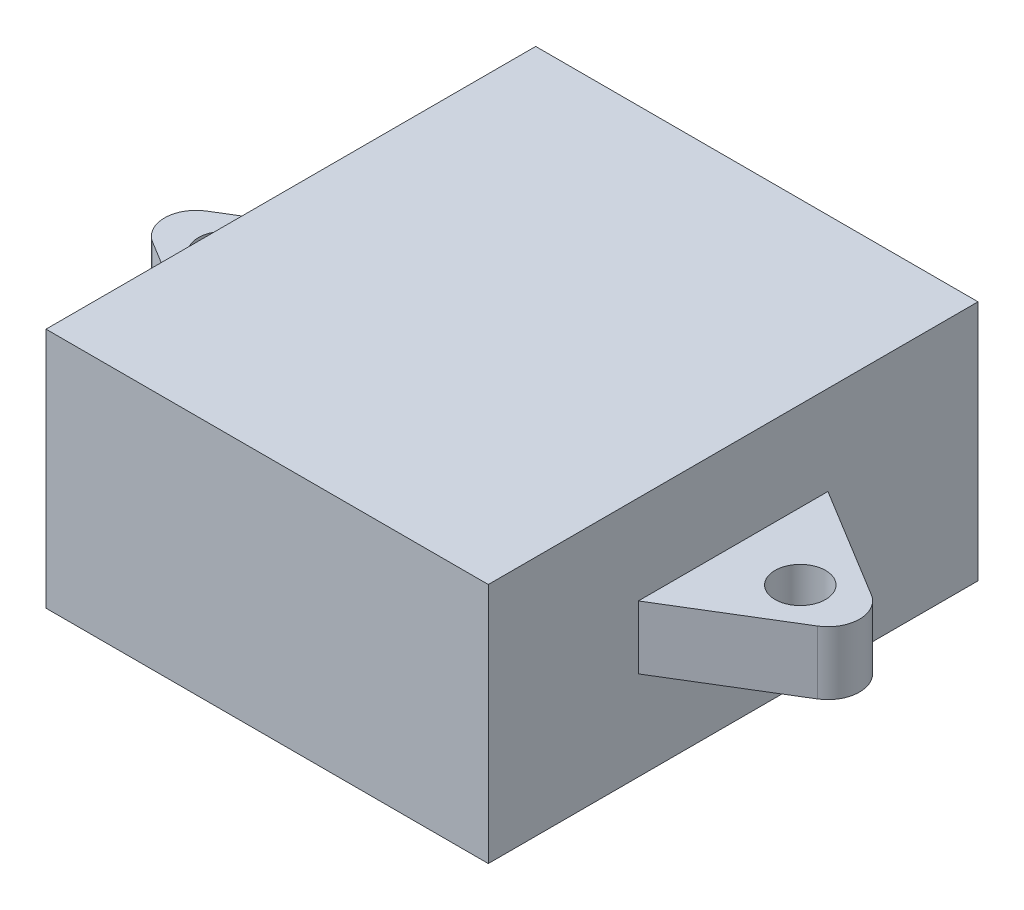
ISO-10303-21;
HEADER;
FILE_DESCRIPTION(('STEP AP214'),'2;1');
FILE_NAME('part.step','',(''),(''),'','','');
FILE_SCHEMA(('AUTOMOTIVE_DESIGN { 1 0 10303 214 1 1 1 1 }'));
ENDSEC;
DATA;
#1=APPLICATION_CONTEXT('core data for automotive mechanical design processes');
#2=APPLICATION_PROTOCOL_DEFINITION('international standard','automotive_design',2000,#1);
#3=PRODUCT_CONTEXT('',#1,'mechanical');
#4=PRODUCT('Part','Part','',(#3));
#5=PRODUCT_RELATED_PRODUCT_CATEGORY('part','',(#4));
#6=PRODUCT_DEFINITION_FORMATION('','',#4);
#7=PRODUCT_DEFINITION_CONTEXT('part definition',#1,'design');
#8=PRODUCT_DEFINITION('design','',#6,#7);
#9=PRODUCT_DEFINITION_SHAPE('','',#8);
#10=(LENGTH_UNIT() NAMED_UNIT(*) SI_UNIT(.MILLI.,.METRE.));
#11=(NAMED_UNIT(*) PLANE_ANGLE_UNIT() SI_UNIT($,.RADIAN.));
#12=(NAMED_UNIT(*) SI_UNIT($,.STERADIAN.) SOLID_ANGLE_UNIT());
#13=UNCERTAINTY_MEASURE_WITH_UNIT(LENGTH_MEASURE(1.E-05),#10,'distance_accuracy_value','');
#14=(GEOMETRIC_REPRESENTATION_CONTEXT(3) GLOBAL_UNCERTAINTY_ASSIGNED_CONTEXT((#13)) GLOBAL_UNIT_ASSIGNED_CONTEXT((#10,
#11,#12)) REPRESENTATION_CONTEXT('',''));
#15=CARTESIAN_POINT('',(0.,0.,0.));
#16=DIRECTION('',(0.,0.,1.));
#17=DIRECTION('',(1.,0.,0.));
#18=AXIS2_PLACEMENT_3D('',#15,#16,#17);
#19=CARTESIAN_POINT('',(14.,15.3,18.7016574585635));
#20=DIRECTION('',(-1.,0.,0.));
#21=DIRECTION('',(0.,0.,1.));
#22=AXIS2_PLACEMENT_3D('',#19,#20,#21);
#23=PLANE('',#22);
#24=DIRECTION('',(0.,0.,1.));
#25=VECTOR('',#24,1.);
#26=CARTESIAN_POINT('',(14.,5.65,-2.79834254143647));
#27=LINE('',#26,#25);
#28=CARTESIAN_POINT('',(14.,5.65,-2.79834254143647));
#29=VERTEX_POINT('',#28);
#30=CARTESIAN_POINT('',(14.,5.65,9.20165745856353));
#31=VERTEX_POINT('',#30);
#32=EDGE_CURVE('E180',#29,#31,#27,.T.);
#33=ORIENTED_EDGE('',*,*,#32,.T.);
#34=DIRECTION('',(0.,1.,0.));
#35=VECTOR('',#34,1.);
#36=CARTESIAN_POINT('',(14.,5.65,9.20165745856353));
#37=LINE('',#36,#35);
#38=CARTESIAN_POINT('',(14.,9.65,9.20165745856353));
#39=VERTEX_POINT('',#38);
#40=EDGE_CURVE('E192',#31,#39,#37,.T.);
#41=ORIENTED_EDGE('',*,*,#40,.T.);
#42=DIRECTION('',(0.,0.,1.));
#43=VECTOR('',#42,1.);
#44=CARTESIAN_POINT('',(14.,9.65,-2.79834254143647));
#45=LINE('',#44,#43);
#46=CARTESIAN_POINT('',(14.,9.65,-2.79834254143647));
#47=VERTEX_POINT('',#46);
#48=EDGE_CURVE('E165',#47,#39,#45,.T.);
#49=ORIENTED_EDGE('',*,*,#48,.F.);
#50=DIRECTION('',(0.,1.,0.));
#51=VECTOR('',#50,1.);
#52=CARTESIAN_POINT('',(14.,5.65,-2.79834254143647));
#53=LINE('',#52,#51);
#54=EDGE_CURVE('E193',#29,#47,#53,.T.);
#55=ORIENTED_EDGE('',*,*,#54,.F.);
#56=EDGE_LOOP('',(#33,#41,#49,#55));
#57=FACE_BOUND('',#56,.T.);
#58=DIRECTION('',(0.,0.,-1.));
#59=VECTOR('',#58,1.);
#60=CARTESIAN_POINT('',(14.,0.,18.7016574585635));
#61=LINE('',#60,#59);
#62=CARTESIAN_POINT('',(14.,0.,18.7016574585635));
#63=VERTEX_POINT('',#62);
#64=CARTESIAN_POINT('',(14.,0.,-12.2983425414365));
#65=VERTEX_POINT('',#64);
#66=EDGE_CURVE('E195',#63,#65,#61,.T.);
#67=ORIENTED_EDGE('',*,*,#66,.T.);
#68=DIRECTION('',(0.,-1.,0.));
#69=VECTOR('',#68,1.);
#70=CARTESIAN_POINT('',(14.,15.3,-12.2983425414365));
#71=LINE('',#70,#69);
#72=CARTESIAN_POINT('',(14.,15.3,-12.2983425414365));
#73=VERTEX_POINT('',#72);
#74=EDGE_CURVE('E11',#73,#65,#71,.T.);
#75=ORIENTED_EDGE('',*,*,#74,.F.);
#76=DIRECTION('',(0.,0.,-1.));
#77=VECTOR('',#76,1.);
#78=CARTESIAN_POINT('',(14.,15.3,18.7016574585635));
#79=LINE('',#78,#77);
#80=CARTESIAN_POINT('',(14.,15.3,18.7016574585635));
#81=VERTEX_POINT('',#80);
#82=EDGE_CURVE('E202',#81,#73,#79,.T.);
#83=ORIENTED_EDGE('',*,*,#82,.F.);
#84=DIRECTION('',(0.,-1.,0.));
#85=VECTOR('',#84,1.);
#86=CARTESIAN_POINT('',(14.,15.3,18.7016574585635));
#87=LINE('',#86,#85);
#88=EDGE_CURVE('E212',#81,#63,#87,.T.);
#89=ORIENTED_EDGE('',*,*,#88,.T.);
#90=EDGE_LOOP('',(#67,#75,#83,#89));
#91=FACE_BOUND('',#90,.T.);
#92=ADVANCED_FACE('F35',(#57,#91),#23,.F.);
#93=CARTESIAN_POINT('',(-14.,15.3,-12.2983425414365));
#94=DIRECTION('',(0.,0.,1.));
#95=DIRECTION('',(1.,0.,0.));
#96=AXIS2_PLACEMENT_3D('',#93,#94,#95);
#97=PLANE('',#96);
#98=DIRECTION('',(-1.,0.,0.));
#99=VECTOR('',#98,1.);
#100=CARTESIAN_POINT('',(-14.,0.,-12.2983425414365));
#101=LINE('',#100,#99);
#102=CARTESIAN_POINT('',(-14.,0.,-12.2983425414365));
#103=VERTEX_POINT('',#102);
#104=EDGE_CURVE('E215',#65,#103,#101,.T.);
#105=ORIENTED_EDGE('',*,*,#104,.T.);
#106=DIRECTION('',(0.,-1.,0.));
#107=VECTOR('',#106,1.);
#108=CARTESIAN_POINT('',(-14.,15.3,-12.2983425414365));
#109=LINE('',#108,#107);
#110=CARTESIAN_POINT('',(-14.,15.3,-12.2983425414365));
#111=VERTEX_POINT('',#110);
#112=EDGE_CURVE('E42',#111,#103,#109,.T.);
#113=ORIENTED_EDGE('',*,*,#112,.F.);
#114=DIRECTION('',(-1.,0.,0.));
#115=VECTOR('',#114,1.);
#116=CARTESIAN_POINT('',(-14.,15.3,-12.2983425414365));
#117=LINE('',#116,#115);
#118=EDGE_CURVE('E205',#73,#111,#117,.T.);
#119=ORIENTED_EDGE('',*,*,#118,.F.);
#120=ORIENTED_EDGE('',*,*,#74,.T.);
#121=EDGE_LOOP('',(#105,#113,#119,#120));
#122=FACE_BOUND('',#121,.T.);
#123=ADVANCED_FACE('F245',(#122),#97,.F.);
#124=CARTESIAN_POINT('',(-14.,15.3,18.7016574585635));
#125=DIRECTION('',(1.,0.,0.));
#126=DIRECTION('',(0.,0.,-1.));
#127=AXIS2_PLACEMENT_3D('',#124,#125,#126);
#128=PLANE('',#127);
#129=DIRECTION('',(0.,0.,1.));
#130=VECTOR('',#129,1.);
#131=CARTESIAN_POINT('',(-14.,5.65,-2.79834254143647));
#132=LINE('',#131,#130);
#133=CARTESIAN_POINT('',(-14.,5.65,-2.79834254143647));
#134=VERTEX_POINT('',#133);
#135=CARTESIAN_POINT('',(-14.,5.65,9.20165745856353));
#136=VERTEX_POINT('',#135);
#137=EDGE_CURVE('E150',#134,#136,#132,.T.);
#138=ORIENTED_EDGE('',*,*,#137,.F.);
#139=DIRECTION('',(0.,1.,0.));
#140=VECTOR('',#139,1.);
#141=CARTESIAN_POINT('',(-14.,5.65,-2.79834254143647));
#142=LINE('',#141,#140);
#143=CARTESIAN_POINT('',(-14.,9.65,-2.79834254143647));
#144=VERTEX_POINT('',#143);
#145=EDGE_CURVE('E49',#134,#144,#142,.T.);
#146=ORIENTED_EDGE('',*,*,#145,.T.);
#147=DIRECTION('',(0.,0.,1.));
#148=VECTOR('',#147,1.);
#149=CARTESIAN_POINT('',(-14.,9.65,-2.79834254143647));
#150=LINE('',#149,#148);
#151=CARTESIAN_POINT('',(-14.,9.65,9.20165745856353));
#152=VERTEX_POINT('',#151);
#153=EDGE_CURVE('E53',#144,#152,#150,.T.);
#154=ORIENTED_EDGE('',*,*,#153,.T.);
#155=DIRECTION('',(0.,1.,0.));
#156=VECTOR('',#155,1.);
#157=CARTESIAN_POINT('',(-14.,5.65,9.20165745856353));
#158=LINE('',#157,#156);
#159=EDGE_CURVE('E158',#136,#152,#158,.T.);
#160=ORIENTED_EDGE('',*,*,#159,.F.);
#161=EDGE_LOOP('',(#138,#146,#154,#160));
#162=FACE_BOUND('',#161,.T.);
#163=DIRECTION('',(0.,0.,1.));
#164=VECTOR('',#163,1.);
#165=CARTESIAN_POINT('',(-14.,0.,18.7016574585635));
#166=LINE('',#165,#164);
#167=CARTESIAN_POINT('',(-14.,0.,18.7016574585635));
#168=VERTEX_POINT('',#167);
#169=EDGE_CURVE('E217',#103,#168,#166,.T.);
#170=ORIENTED_EDGE('',*,*,#169,.T.);
#171=DIRECTION('',(0.,-1.,0.));
#172=VECTOR('',#171,1.);
#173=CARTESIAN_POINT('',(-14.,15.3,18.7016574585635));
#174=LINE('',#173,#172);
#175=CARTESIAN_POINT('',(-14.,15.3,18.7016574585635));
#176=VERTEX_POINT('',#175);
#177=EDGE_CURVE('E222',#176,#168,#174,.T.);
#178=ORIENTED_EDGE('',*,*,#177,.F.);
#179=DIRECTION('',(0.,0.,1.));
#180=VECTOR('',#179,1.);
#181=CARTESIAN_POINT('',(-14.,15.3,18.7016574585635));
#182=LINE('',#181,#180);
#183=EDGE_CURVE('E208',#111,#176,#182,.T.);
#184=ORIENTED_EDGE('',*,*,#183,.F.);
#185=ORIENTED_EDGE('',*,*,#112,.T.);
#186=EDGE_LOOP('',(#170,#178,#184,#185));
#187=FACE_BOUND('',#186,.T.);
#188=ADVANCED_FACE('F229',(#162,#187),#128,.F.);
#189=CARTESIAN_POINT('',(-14.,15.3,18.7016574585635));
#190=DIRECTION('',(0.,0.,-1.));
#191=DIRECTION('',(-1.,0.,0.));
#192=AXIS2_PLACEMENT_3D('',#189,#190,#191);
#193=PLANE('',#192);
#194=DIRECTION('',(1.,0.,0.));
#195=VECTOR('',#194,1.);
#196=CARTESIAN_POINT('',(-14.,0.,18.7016574585635));
#197=LINE('',#196,#195);
#198=EDGE_CURVE('E206',#168,#63,#197,.T.);
#199=ORIENTED_EDGE('',*,*,#198,.T.);
#200=ORIENTED_EDGE('',*,*,#88,.F.);
#201=DIRECTION('',(1.,0.,0.));
#202=VECTOR('',#201,1.);
#203=CARTESIAN_POINT('',(-14.,15.3,18.7016574585635));
#204=LINE('',#203,#202);
#205=EDGE_CURVE('E210',#176,#81,#204,.T.);
#206=ORIENTED_EDGE('',*,*,#205,.F.);
#207=ORIENTED_EDGE('',*,*,#177,.T.);
#208=EDGE_LOOP('',(#199,#200,#206,#207));
#209=FACE_BOUND('',#208,.T.);
#210=ADVANCED_FACE('F238',(#209),#193,.F.);
#211=CARTESIAN_POINT('',(0.,15.3,0.));
#212=DIRECTION('',(0.,-1.,0.));
#213=DIRECTION('',(0.,0.,-1.));
#214=AXIS2_PLACEMENT_3D('',#211,#212,#213);
#215=PLANE('',#214);
#216=ORIENTED_EDGE('',*,*,#82,.T.);
#217=ORIENTED_EDGE('',*,*,#118,.T.);
#218=ORIENTED_EDGE('',*,*,#183,.T.);
#219=ORIENTED_EDGE('',*,*,#205,.T.);
#220=EDGE_LOOP('',(#216,#217,#218,#219));
#221=FACE_BOUND('',#220,.T.);
#222=ADVANCED_FACE('F244',(#221),#215,.F.);
#223=CARTESIAN_POINT('',(0.,0.,0.));
#224=DIRECTION('',(0.,-1.,0.));
#225=DIRECTION('',(0.,0.,-1.));
#226=AXIS2_PLACEMENT_3D('',#223,#224,#225);
#227=PLANE('',#226);
#228=ORIENTED_EDGE('',*,*,#66,.F.);
#229=ORIENTED_EDGE('',*,*,#198,.F.);
#230=ORIENTED_EDGE('',*,*,#169,.F.);
#231=ORIENTED_EDGE('',*,*,#104,.F.);
#232=EDGE_LOOP('',(#228,#229,#230,#231));
#233=FACE_BOUND('',#232,.T.);
#234=ADVANCED_FACE('F235',(#233),#227,.T.);
#235=CARTESIAN_POINT('',(14.,5.65,-2.79834254143647));
#236=DIRECTION('',(0.52051760426961,0.,-0.853850937602943));
#237=DIRECTION('',(-0.853850937602943,0.,-0.52051760426961));
#238=AXIS2_PLACEMENT_3D('',#235,#236,#237);
#239=PLANE('',#238);
#240=ORIENTED_EDGE('',*,*,#54,.T.);
#241=DIRECTION('',(-0.853850937602943,0.,-0.52051760426961));
#242=VECTOR('',#241,1.);
#243=CARTESIAN_POINT('',(14.,9.65,-2.79834254143647));
#244=LINE('',#243,#242);
#245=CARTESIAN_POINT('',(21.0410352085392,9.65,1.49395558335765));
#246=VERTEX_POINT('',#245);
#247=EDGE_CURVE('E174',#246,#47,#244,.T.);
#248=ORIENTED_EDGE('',*,*,#247,.F.);
#249=DIRECTION('',(0.,1.,0.));
#250=VECTOR('',#249,1.);
#251=CARTESIAN_POINT('',(21.0410352085392,5.65,1.49395558335765));
#252=LINE('',#251,#250);
#253=CARTESIAN_POINT('',(21.0410352085392,5.65,1.49395558335765));
#254=VERTEX_POINT('',#253);
#255=EDGE_CURVE('E196',#254,#246,#252,.T.);
#256=ORIENTED_EDGE('',*,*,#255,.F.);
#257=DIRECTION('',(-0.853850937602943,0.,-0.52051760426961));
#258=VECTOR('',#257,1.);
#259=CARTESIAN_POINT('',(14.,5.65,-2.79834254143647));
#260=LINE('',#259,#258);
#261=EDGE_CURVE('E189',#254,#29,#260,.T.);
#262=ORIENTED_EDGE('',*,*,#261,.T.);
#263=EDGE_LOOP('',(#240,#248,#256,#262));
#264=FACE_BOUND('',#263,.T.);
#265=ADVANCED_FACE('F258',(#264),#239,.T.);
#266=CARTESIAN_POINT('',(20.,5.65,3.20165745856353));
#267=DIRECTION('',(0.,1.,0.));
#268=DIRECTION('',(0.,0.,1.));
#269=AXIS2_PLACEMENT_3D('',#266,#267,#268);
#270=CYLINDRICAL_SURFACE('',#269,2.);
#271=ORIENTED_EDGE('',*,*,#255,.T.);
#272=CARTESIAN_POINT('',(20.,9.65,3.20165745856353));
#273=DIRECTION('',(0.,1.,0.));
#274=DIRECTION('',(0.,0.,-1.));
#275=AXIS2_PLACEMENT_3D('',#272,#273,#274);
#276=CIRCLE('',#275,2.);
#277=CARTESIAN_POINT('',(21.0410352085392,9.65,4.90935933376942));
#278=VERTEX_POINT('',#277);
#279=EDGE_CURVE('E171',#278,#246,#276,.T.);
#280=ORIENTED_EDGE('',*,*,#279,.F.);
#281=DIRECTION('',(0.,1.,0.));
#282=VECTOR('',#281,1.);
#283=CARTESIAN_POINT('',(21.0410352085392,5.65,4.90935933376942));
#284=LINE('',#283,#282);
#285=CARTESIAN_POINT('',(21.0410352085392,5.65,4.90935933376942));
#286=VERTEX_POINT('',#285);
#287=EDGE_CURVE('E198',#286,#278,#284,.T.);
#288=ORIENTED_EDGE('',*,*,#287,.F.);
#289=CARTESIAN_POINT('',(20.,5.65,3.20165745856353));
#290=DIRECTION('',(0.,1.,0.));
#291=DIRECTION('',(0.,0.,-1.));
#292=AXIS2_PLACEMENT_3D('',#289,#290,#291);
#293=CIRCLE('',#292,2.);
#294=EDGE_CURVE('E186',#286,#254,#293,.T.);
#295=ORIENTED_EDGE('',*,*,#294,.T.);
#296=EDGE_LOOP('',(#271,#280,#288,#295));
#297=FACE_BOUND('',#296,.T.);
#298=ADVANCED_FACE('F265',(#297),#270,.T.);
#299=CARTESIAN_POINT('',(21.0410352085392,5.65,4.90935933376942));
#300=DIRECTION('',(0.52051760426961,0.,0.853850937602943));
#301=DIRECTION('',(0.853850937602943,0.,-0.52051760426961));
#302=AXIS2_PLACEMENT_3D('',#299,#300,#301);
#303=PLANE('',#302);
#304=ORIENTED_EDGE('',*,*,#287,.T.);
#305=DIRECTION('',(0.853850937602943,0.,-0.52051760426961));
#306=VECTOR('',#305,1.);
#307=CARTESIAN_POINT('',(21.0410352085392,9.65,4.90935933376942));
#308=LINE('',#307,#306);
#309=EDGE_CURVE('E168',#39,#278,#308,.T.);
#310=ORIENTED_EDGE('',*,*,#309,.F.);
#311=ORIENTED_EDGE('',*,*,#40,.F.);
#312=DIRECTION('',(0.853850937602943,0.,-0.52051760426961));
#313=VECTOR('',#312,1.);
#314=CARTESIAN_POINT('',(21.0410352085392,5.65,4.90935933376942));
#315=LINE('',#314,#313);
#316=EDGE_CURVE('E183',#31,#286,#315,.T.);
#317=ORIENTED_EDGE('',*,*,#316,.T.);
#318=EDGE_LOOP('',(#304,#310,#311,#317));
#319=FACE_BOUND('',#318,.T.);
#320=ADVANCED_FACE('F261',(#319),#303,.T.);
#321=CARTESIAN_POINT('',(20.,5.65,3.20165745856353));
#322=DIRECTION('',(0.,-1.,0.));
#323=DIRECTION('',(0.,0.,-1.));
#324=AXIS2_PLACEMENT_3D('',#321,#322,#323);
#325=PLANE('',#324);
#326=CARTESIAN_POINT('',(18.25,5.65,3.20165745856353));
#327=DIRECTION('',(0.,1.,0.));
#328=DIRECTION('',(0.,0.,1.));
#329=AXIS2_PLACEMENT_3D('',#326,#327,#328);
#330=CIRCLE('',#329,1.6);
#331=CARTESIAN_POINT('',(18.25,5.65,4.80165745856353));
#332=VERTEX_POINT('',#331);
#333=EDGE_CURVE('E177',#332,#332,#330,.T.);
#334=ORIENTED_EDGE('',*,*,#333,.T.);
#335=EDGE_LOOP('',(#334));
#336=FACE_BOUND('',#335,.T.);
#337=ORIENTED_EDGE('',*,*,#32,.F.);
#338=ORIENTED_EDGE('',*,*,#261,.F.);
#339=ORIENTED_EDGE('',*,*,#294,.F.);
#340=ORIENTED_EDGE('',*,*,#316,.F.);
#341=EDGE_LOOP('',(#337,#338,#339,#340));
#342=FACE_BOUND('',#341,.T.);
#343=ADVANCED_FACE('F264',(#336,#342),#325,.T.);
#344=CARTESIAN_POINT('',(18.25,5.65,3.20165745856353));
#345=DIRECTION('',(0.,1.,0.));
#346=DIRECTION('',(0.,0.,1.));
#347=AXIS2_PLACEMENT_3D('',#344,#345,#346);
#348=CYLINDRICAL_SURFACE('',#347,1.6);
#349=ORIENTED_EDGE('',*,*,#333,.F.);
#350=EDGE_LOOP('',(#349));
#351=FACE_BOUND('',#350,.T.);
#352=CARTESIAN_POINT('',(18.25,9.65,3.20165745856353));
#353=DIRECTION('',(0.,1.,0.));
#354=DIRECTION('',(0.,0.,1.));
#355=AXIS2_PLACEMENT_3D('',#352,#353,#354);
#356=CIRCLE('',#355,1.6);
#357=CARTESIAN_POINT('',(18.25,9.65,4.80165745856353));
#358=VERTEX_POINT('',#357);
#359=EDGE_CURVE('E160',#358,#358,#356,.T.);
#360=ORIENTED_EDGE('',*,*,#359,.T.);
#361=EDGE_LOOP('',(#360));
#362=FACE_BOUND('',#361,.T.);
#363=ADVANCED_FACE('F275',(#351,#362),#348,.F.);
#364=CARTESIAN_POINT('',(20.,9.65,3.20165745856353));
#365=DIRECTION('',(0.,-1.,0.));
#366=DIRECTION('',(0.,0.,-1.));
#367=AXIS2_PLACEMENT_3D('',#364,#365,#366);
#368=PLANE('',#367);
#369=ORIENTED_EDGE('',*,*,#48,.T.);
#370=ORIENTED_EDGE('',*,*,#309,.T.);
#371=ORIENTED_EDGE('',*,*,#279,.T.);
#372=ORIENTED_EDGE('',*,*,#247,.T.);
#373=EDGE_LOOP('',(#369,#370,#371,#372));
#374=FACE_BOUND('',#373,.T.);
#375=ORIENTED_EDGE('',*,*,#359,.F.);
#376=EDGE_LOOP('',(#375));
#377=FACE_BOUND('',#376,.T.);
#378=ADVANCED_FACE('F279',(#374,#377),#368,.F.);
#379=CARTESIAN_POINT('',(-20.,5.65,3.20165745856353));
#380=DIRECTION('',(0.,-1.,0.));
#381=DIRECTION('',(0.,0.,-1.));
#382=AXIS2_PLACEMENT_3D('',#379,#380,#381);
#383=PLANE('',#382);
#384=ORIENTED_EDGE('',*,*,#137,.T.);
#385=DIRECTION('',(-0.853850937602943,0.,-0.52051760426961));
#386=VECTOR('',#385,1.);
#387=CARTESIAN_POINT('',(-21.0410352085392,5.65,4.90935933376942));
#388=LINE('',#387,#386);
#389=CARTESIAN_POINT('',(-21.0410352085392,5.65,4.90935933376942));
#390=VERTEX_POINT('',#389);
#391=EDGE_CURVE('E156',#136,#390,#388,.T.);
#392=ORIENTED_EDGE('',*,*,#391,.T.);
#393=CARTESIAN_POINT('',(-20.,5.65,3.20165745856353));
#394=DIRECTION('',(0.,-1.,0.));
#395=DIRECTION('',(0.,0.,-1.));
#396=AXIS2_PLACEMENT_3D('',#393,#394,#395);
#397=CIRCLE('',#396,2.);
#398=CARTESIAN_POINT('',(-21.0410352085392,5.65,1.49395558335765));
#399=VERTEX_POINT('',#398);
#400=EDGE_CURVE('E154',#390,#399,#397,.T.);
#401=ORIENTED_EDGE('',*,*,#400,.T.);
#402=DIRECTION('',(0.853850937602943,0.,-0.52051760426961));
#403=VECTOR('',#402,1.);
#404=CARTESIAN_POINT('',(-14.,5.65,-2.79834254143647));
#405=LINE('',#404,#403);
#406=EDGE_CURVE('E127',#399,#134,#405,.T.);
#407=ORIENTED_EDGE('',*,*,#406,.T.);
#408=EDGE_LOOP('',(#384,#392,#401,#407));
#409=FACE_BOUND('',#408,.T.);
#410=CARTESIAN_POINT('',(-18.25,5.65,3.20165745856353));
#411=DIRECTION('',(0.,-1.,0.));
#412=DIRECTION('',(0.,0.,1.));
#413=AXIS2_PLACEMENT_3D('',#410,#411,#412);
#414=CIRCLE('',#413,1.6);
#415=CARTESIAN_POINT('',(-18.25,5.65,4.80165745856353));
#416=VERTEX_POINT('',#415);
#417=EDGE_CURVE('E144',#416,#416,#414,.T.);
#418=ORIENTED_EDGE('',*,*,#417,.F.);
#419=EDGE_LOOP('',(#418));
#420=FACE_BOUND('',#419,.T.);
#421=ADVANCED_FACE('F283',(#409,#420),#383,.T.);
#422=CARTESIAN_POINT('',(-21.0410352085392,5.65,4.90935933376942));
#423=DIRECTION('',(0.52051760426961,0.,-0.853850937602943));
#424=DIRECTION('',(-0.853850937602943,0.,-0.52051760426961));
#425=AXIS2_PLACEMENT_3D('',#422,#423,#424);
#426=PLANE('',#425);
#427=ORIENTED_EDGE('',*,*,#159,.T.);
#428=DIRECTION('',(-0.853850937602943,0.,-0.52051760426961));
#429=VECTOR('',#428,1.);
#430=CARTESIAN_POINT('',(-21.0410352085392,9.65,4.90935933376942));
#431=LINE('',#430,#429);
#432=CARTESIAN_POINT('',(-21.0410352085392,9.65,4.90935933376942));
#433=VERTEX_POINT('',#432);
#434=EDGE_CURVE('E142',#152,#433,#431,.T.);
#435=ORIENTED_EDGE('',*,*,#434,.T.);
#436=DIRECTION('',(0.,1.,0.));
#437=VECTOR('',#436,1.);
#438=CARTESIAN_POINT('',(-21.0410352085392,5.65,4.90935933376942));
#439=LINE('',#438,#437);
#440=EDGE_CURVE('E131',#390,#433,#439,.T.);
#441=ORIENTED_EDGE('',*,*,#440,.F.);
#442=ORIENTED_EDGE('',*,*,#391,.F.);
#443=EDGE_LOOP('',(#427,#435,#441,#442));
#444=FACE_BOUND('',#443,.T.);
#445=ADVANCED_FACE('F290',(#444),#426,.F.);
#446=CARTESIAN_POINT('',(-20.,5.65,3.20165745856353));
#447=DIRECTION('',(0.,1.,0.));
#448=DIRECTION('',(0.,0.,1.));
#449=AXIS2_PLACEMENT_3D('',#446,#447,#448);
#450=CYLINDRICAL_SURFACE('',#449,2.);
#451=ORIENTED_EDGE('',*,*,#440,.T.);
#452=CARTESIAN_POINT('',(-20.,9.65,3.20165745856353));
#453=DIRECTION('',(0.,-1.,0.));
#454=DIRECTION('',(0.,0.,-1.));
#455=AXIS2_PLACEMENT_3D('',#452,#453,#454);
#456=CIRCLE('',#455,2.);
#457=CARTESIAN_POINT('',(-21.0410352085392,9.65,1.49395558335765));
#458=VERTEX_POINT('',#457);
#459=EDGE_CURVE('E137',#433,#458,#456,.T.);
#460=ORIENTED_EDGE('',*,*,#459,.T.);
#461=DIRECTION('',(0.,1.,0.));
#462=VECTOR('',#461,1.);
#463=CARTESIAN_POINT('',(-21.0410352085392,5.65,1.49395558335765));
#464=LINE('',#463,#462);
#465=EDGE_CURVE('E122',#399,#458,#464,.T.);
#466=ORIENTED_EDGE('',*,*,#465,.F.);
#467=ORIENTED_EDGE('',*,*,#400,.F.);
#468=EDGE_LOOP('',(#451,#460,#466,#467));
#469=FACE_BOUND('',#468,.T.);
#470=ADVANCED_FACE('F140',(#469),#450,.T.);
#471=CARTESIAN_POINT('',(-14.,5.65,-2.79834254143647));
#472=DIRECTION('',(0.52051760426961,0.,0.853850937602943));
#473=DIRECTION('',(0.853850937602943,0.,-0.52051760426961));
#474=AXIS2_PLACEMENT_3D('',#471,#472,#473);
#475=PLANE('',#474);
#476=ORIENTED_EDGE('',*,*,#465,.T.);
#477=DIRECTION('',(0.853850937602943,0.,-0.52051760426961));
#478=VECTOR('',#477,1.);
#479=CARTESIAN_POINT('',(-14.,9.65,-2.79834254143647));
#480=LINE('',#479,#478);
#481=EDGE_CURVE('E125',#458,#144,#480,.T.);
#482=ORIENTED_EDGE('',*,*,#481,.T.);
#483=ORIENTED_EDGE('',*,*,#145,.F.);
#484=ORIENTED_EDGE('',*,*,#406,.F.);
#485=EDGE_LOOP('',(#476,#482,#483,#484));
#486=FACE_BOUND('',#485,.T.);
#487=ADVANCED_FACE('F124',(#486),#475,.F.);
#488=CARTESIAN_POINT('',(-18.25,5.65,3.20165745856353));
#489=DIRECTION('',(0.,1.,0.));
#490=DIRECTION('',(0.,0.,1.));
#491=AXIS2_PLACEMENT_3D('',#488,#489,#490);
#492=CYLINDRICAL_SURFACE('',#491,1.6);
#493=ORIENTED_EDGE('',*,*,#417,.T.);
#494=EDGE_LOOP('',(#493));
#495=FACE_BOUND('',#494,.T.);
#496=CARTESIAN_POINT('',(-18.25,9.65,3.20165745856353));
#497=DIRECTION('',(0.,-1.,0.));
#498=DIRECTION('',(0.,0.,1.));
#499=AXIS2_PLACEMENT_3D('',#496,#497,#498);
#500=CIRCLE('',#499,1.6);
#501=CARTESIAN_POINT('',(-18.25,9.65,4.80165745856353));
#502=VERTEX_POINT('',#501);
#503=EDGE_CURVE('E306',#502,#502,#500,.T.);
#504=ORIENTED_EDGE('',*,*,#503,.F.);
#505=EDGE_LOOP('',(#504));
#506=FACE_BOUND('',#505,.T.);
#507=ADVANCED_FACE('F287',(#495,#506),#492,.F.);
#508=CARTESIAN_POINT('',(-20.,9.65,3.20165745856353));
#509=DIRECTION('',(0.,-1.,0.));
#510=DIRECTION('',(0.,0.,-1.));
#511=AXIS2_PLACEMENT_3D('',#508,#509,#510);
#512=PLANE('',#511);
#513=ORIENTED_EDGE('',*,*,#503,.T.);
#514=EDGE_LOOP('',(#513));
#515=FACE_BOUND('',#514,.T.);
#516=ORIENTED_EDGE('',*,*,#153,.F.);
#517=ORIENTED_EDGE('',*,*,#481,.F.);
#518=ORIENTED_EDGE('',*,*,#459,.F.);
#519=ORIENTED_EDGE('',*,*,#434,.F.);
#520=EDGE_LOOP('',(#516,#517,#518,#519));
#521=FACE_BOUND('',#520,.T.);
#522=ADVANCED_FACE('F135',(#515,#521),#512,.F.);
#523=CLOSED_SHELL('',(#92,#123,#188,#210,#222,#234,#265,#298,#320,#343,#363,#378,#421,#445,#470,
#487,#507,#522));
#524=MANIFOLD_SOLID_BREP('B2',#523);
#525=ADVANCED_BREP_SHAPE_REPRESENTATION('',(#18,#524),#14);
#526=SHAPE_DEFINITION_REPRESENTATION(#9,#525);
ENDSEC;
END-ISO-10303-21;
